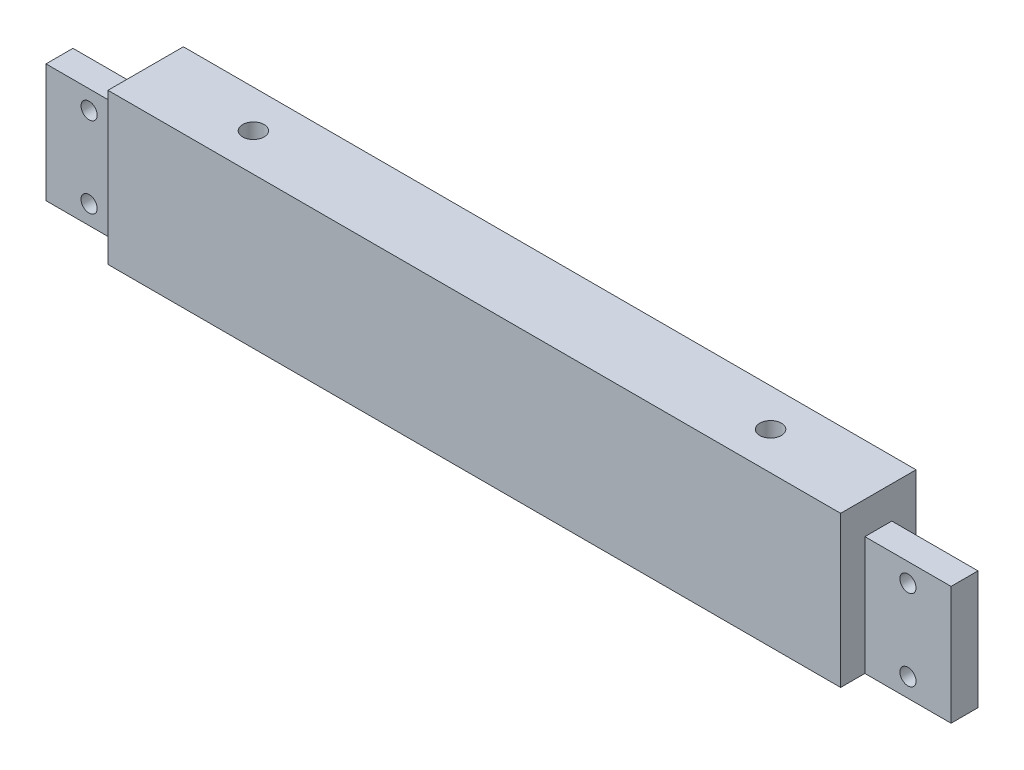
ISO-10303-21;
HEADER;
FILE_DESCRIPTION(('STEP AP214'),'2;1');
FILE_NAME('part.step','',(''),(''),'','','');
FILE_SCHEMA(('AUTOMOTIVE_DESIGN { 1 0 10303 214 1 1 1 1 }'));
ENDSEC;
DATA;
#1=APPLICATION_CONTEXT('core data for automotive mechanical design processes');
#2=APPLICATION_PROTOCOL_DEFINITION('international standard','automotive_design',2000,#1);
#3=PRODUCT_CONTEXT('',#1,'mechanical');
#4=PRODUCT('Part','Part','',(#3));
#5=PRODUCT_RELATED_PRODUCT_CATEGORY('part','',(#4));
#6=PRODUCT_DEFINITION_FORMATION('','',#4);
#7=PRODUCT_DEFINITION_CONTEXT('part definition',#1,'design');
#8=PRODUCT_DEFINITION('design','',#6,#7);
#9=PRODUCT_DEFINITION_SHAPE('','',#8);
#10=(LENGTH_UNIT() NAMED_UNIT(*) SI_UNIT(.MILLI.,.METRE.));
#11=(NAMED_UNIT(*) PLANE_ANGLE_UNIT() SI_UNIT($,.RADIAN.));
#12=(NAMED_UNIT(*) SI_UNIT($,.STERADIAN.) SOLID_ANGLE_UNIT());
#13=UNCERTAINTY_MEASURE_WITH_UNIT(LENGTH_MEASURE(1.E-05),#10,'distance_accuracy_value','');
#14=(GEOMETRIC_REPRESENTATION_CONTEXT(3) GLOBAL_UNCERTAINTY_ASSIGNED_CONTEXT((#13)) GLOBAL_UNIT_ASSIGNED_CONTEXT((#10,
#11,#12)) REPRESENTATION_CONTEXT('',''));
#15=CARTESIAN_POINT('',(0.,0.,0.));
#16=DIRECTION('',(0.,0.,1.));
#17=DIRECTION('',(1.,0.,0.));
#18=AXIS2_PLACEMENT_3D('',#15,#16,#17);
#19=CARTESIAN_POINT('',(-215.9,44.45,22.225));
#20=DIRECTION('',(1.,0.,0.));
#21=DIRECTION('',(0.,0.,-1.));
#22=AXIS2_PLACEMENT_3D('',#19,#20,#21);
#23=PLANE('',#22);
#24=DIRECTION('',(0.,0.,1.));
#25=VECTOR('',#24,1.);
#26=CARTESIAN_POINT('',(-215.9,25.4,-7.93749999999999));
#27=LINE('',#26,#25);
#28=CARTESIAN_POINT('',(-215.9,25.4,-7.93749999999999));
#29=VERTEX_POINT('',#28);
#30=CARTESIAN_POINT('',(-215.9,25.4,7.93750000000001));
#31=VERTEX_POINT('',#30);
#32=EDGE_CURVE('E49',#29,#31,#27,.T.);
#33=ORIENTED_EDGE('',*,*,#32,.T.);
#34=DIRECTION('',(0.,-1.,0.));
#35=VECTOR('',#34,1.);
#36=CARTESIAN_POINT('',(-215.9,25.4,7.93750000000001));
#37=LINE('',#36,#35);
#38=CARTESIAN_POINT('',(-215.9,-44.45,7.9375));
#39=VERTEX_POINT('',#38);
#40=EDGE_CURVE('E142',#31,#39,#37,.T.);
#41=ORIENTED_EDGE('',*,*,#40,.T.);
#42=DIRECTION('',(0.,0.,-1.));
#43=VECTOR('',#42,1.);
#44=CARTESIAN_POINT('',(-215.9,-44.45,22.225));
#45=LINE('',#44,#43);
#46=CARTESIAN_POINT('',(-215.9,-44.45,22.225));
#47=VERTEX_POINT('',#46);
#48=EDGE_CURVE('E11',#47,#39,#45,.T.);
#49=ORIENTED_EDGE('',*,*,#48,.F.);
#50=DIRECTION('',(0.,-1.,0.));
#51=VECTOR('',#50,1.);
#52=CARTESIAN_POINT('',(-215.9,44.45,22.225));
#53=LINE('',#52,#51);
#54=CARTESIAN_POINT('',(-215.9,44.45,22.225));
#55=VERTEX_POINT('',#54);
#56=EDGE_CURVE('E197',#55,#47,#53,.T.);
#57=ORIENTED_EDGE('',*,*,#56,.F.);
#58=DIRECTION('',(0.,0.,-1.));
#59=VECTOR('',#58,1.);
#60=CARTESIAN_POINT('',(-215.9,44.45,22.225));
#61=LINE('',#60,#59);
#62=CARTESIAN_POINT('',(-215.9,44.45,-22.225));
#63=VERTEX_POINT('',#62);
#64=EDGE_CURVE('E207',#55,#63,#61,.T.);
#65=ORIENTED_EDGE('',*,*,#64,.T.);
#66=DIRECTION('',(0.,-1.,0.));
#67=VECTOR('',#66,1.);
#68=CARTESIAN_POINT('',(-215.9,44.45,-22.225));
#69=LINE('',#68,#67);
#70=CARTESIAN_POINT('',(-215.9,-44.45,-22.225));
#71=VERTEX_POINT('',#70);
#72=EDGE_CURVE('E196',#63,#71,#69,.T.);
#73=ORIENTED_EDGE('',*,*,#72,.T.);
#74=CARTESIAN_POINT('',(-215.9,-44.45,-7.9375));
#75=VERTEX_POINT('',#74);
#76=EDGE_CURVE('E41',#75,#71,#45,.T.);
#77=ORIENTED_EDGE('',*,*,#76,.F.);
#78=DIRECTION('',(0.,-1.,0.));
#79=VECTOR('',#78,1.);
#80=CARTESIAN_POINT('',(-215.9,25.4,-7.93749999999999));
#81=LINE('',#80,#79);
#82=EDGE_CURVE('E54',#29,#75,#81,.T.);
#83=ORIENTED_EDGE('',*,*,#82,.F.);
#84=EDGE_LOOP('',(#33,#41,#49,#57,#65,#73,#77,#83));
#85=FACE_BOUND('',#84,.T.);
#86=ADVANCED_FACE('F33',(#85),#23,.F.);
#87=CARTESIAN_POINT('',(215.9,-44.45,22.225));
#88=DIRECTION('',(0.,1.,0.));
#89=DIRECTION('',(-1.,0.,0.));
#90=AXIS2_PLACEMENT_3D('',#87,#88,#89);
#91=PLANE('',#90);
#92=CARTESIAN_POINT('',(152.4,-44.45,0.));
#93=DIRECTION('',(0.,1.,0.));
#94=DIRECTION('',(-1.,0.,0.));
#95=AXIS2_PLACEMENT_3D('',#92,#93,#94);
#96=CIRCLE('',#95,6.35);
#97=CARTESIAN_POINT('',(146.05,-44.45,0.));
#98=VERTEX_POINT('',#97);
#99=EDGE_CURVE('E341',#98,#98,#96,.T.);
#100=ORIENTED_EDGE('',*,*,#99,.T.);
#101=EDGE_LOOP('',(#100));
#102=FACE_BOUND('',#101,.T.);
#103=CARTESIAN_POINT('',(-152.4,-44.4500000000001,0.));
#104=DIRECTION('',(0.,1.,0.));
#105=DIRECTION('',(-1.,0.,0.));
#106=AXIS2_PLACEMENT_3D('',#103,#104,#105);
#107=CIRCLE('',#106,6.35);
#108=CARTESIAN_POINT('',(-158.75,-44.4500000000001,0.));
#109=VERTEX_POINT('',#108);
#110=EDGE_CURVE('E349',#109,#109,#107,.T.);
#111=ORIENTED_EDGE('',*,*,#110,.T.);
#112=EDGE_LOOP('',(#111));
#113=FACE_BOUND('',#112,.T.);
#114=DIRECTION('',(1.,0.,0.));
#115=VECTOR('',#114,1.);
#116=CARTESIAN_POINT('',(215.9,-44.45,-22.225));
#117=LINE('',#116,#115);
#118=CARTESIAN_POINT('',(215.9,-44.45,-22.225));
#119=VERTEX_POINT('',#118);
#120=EDGE_CURVE('E210',#71,#119,#117,.T.);
#121=ORIENTED_EDGE('',*,*,#120,.T.);
#122=DIRECTION('',(0.,0.,-1.));
#123=VECTOR('',#122,1.);
#124=CARTESIAN_POINT('',(215.9,-44.45,22.225));
#125=LINE('',#124,#123);
#126=CARTESIAN_POINT('',(215.9,-44.45,-7.9375));
#127=VERTEX_POINT('',#126);
#128=EDGE_CURVE('E221',#127,#119,#125,.T.);
#129=ORIENTED_EDGE('',*,*,#128,.F.);
#130=DIRECTION('',(-1.,0.,0.));
#131=VECTOR('',#130,1.);
#132=CARTESIAN_POINT('',(266.7,-44.45,-7.9375));
#133=LINE('',#132,#131);
#134=CARTESIAN_POINT('',(266.7,-44.45,-7.9375));
#135=VERTEX_POINT('',#134);
#136=EDGE_CURVE('E187',#135,#127,#133,.T.);
#137=ORIENTED_EDGE('',*,*,#136,.F.);
#138=DIRECTION('',(0.,0.,1.));
#139=VECTOR('',#138,1.);
#140=CARTESIAN_POINT('',(266.7,-44.45,-7.9375));
#141=LINE('',#140,#139);
#142=CARTESIAN_POINT('',(266.7,-44.45,7.9375));
#143=VERTEX_POINT('',#142);
#144=EDGE_CURVE('E171',#135,#143,#141,.T.);
#145=ORIENTED_EDGE('',*,*,#144,.T.);
#146=DIRECTION('',(-1.,0.,0.));
#147=VECTOR('',#146,1.);
#148=CARTESIAN_POINT('',(266.7,-44.45,7.9375));
#149=LINE('',#148,#147);
#150=CARTESIAN_POINT('',(215.9,-44.45,7.9375));
#151=VERTEX_POINT('',#150);
#152=EDGE_CURVE('E190',#143,#151,#149,.T.);
#153=ORIENTED_EDGE('',*,*,#152,.T.);
#154=CARTESIAN_POINT('',(215.9,-44.45,22.225));
#155=VERTEX_POINT('',#154);
#156=EDGE_CURVE('E222',#155,#151,#125,.T.);
#157=ORIENTED_EDGE('',*,*,#156,.F.);
#158=DIRECTION('',(1.,0.,0.));
#159=VECTOR('',#158,1.);
#160=CARTESIAN_POINT('',(215.9,-44.45,22.225));
#161=LINE('',#160,#159);
#162=EDGE_CURVE('E200',#47,#155,#161,.T.);
#163=ORIENTED_EDGE('',*,*,#162,.F.);
#164=ORIENTED_EDGE('',*,*,#48,.T.);
#165=DIRECTION('',(1.,0.,0.));
#166=VECTOR('',#165,1.);
#167=CARTESIAN_POINT('',(-266.7,-44.45,7.9375));
#168=LINE('',#167,#166);
#169=CARTESIAN_POINT('',(-266.7,-44.45,7.9375));
#170=VERTEX_POINT('',#169);
#171=EDGE_CURVE('E155',#170,#39,#168,.T.);
#172=ORIENTED_EDGE('',*,*,#171,.F.);
#173=DIRECTION('',(0.,0.,1.));
#174=VECTOR('',#173,1.);
#175=CARTESIAN_POINT('',(-266.7,-44.45,-7.9375));
#176=LINE('',#175,#174);
#177=CARTESIAN_POINT('',(-266.7,-44.45,-7.9375));
#178=VERTEX_POINT('',#177);
#179=EDGE_CURVE('E137',#178,#170,#176,.T.);
#180=ORIENTED_EDGE('',*,*,#179,.F.);
#181=DIRECTION('',(1.,0.,0.));
#182=VECTOR('',#181,1.);
#183=CARTESIAN_POINT('',(-266.7,-44.45,-7.9375));
#184=LINE('',#183,#182);
#185=EDGE_CURVE('E129',#178,#75,#184,.T.);
#186=ORIENTED_EDGE('',*,*,#185,.T.);
#187=ORIENTED_EDGE('',*,*,#76,.T.);
#188=EDGE_LOOP('',(#121,#129,#137,#145,#153,#157,#163,#164,#172,#180,#186,#187));
#189=FACE_BOUND('',#188,.T.);
#190=ADVANCED_FACE('F242',(#102,#113,#189),#91,.F.);
#191=CARTESIAN_POINT('',(215.9,44.45,22.225));
#192=DIRECTION('',(-1.,0.,0.));
#193=DIRECTION('',(0.,0.,1.));
#194=AXIS2_PLACEMENT_3D('',#191,#192,#193);
#195=PLANE('',#194);
#196=DIRECTION('',(0.,0.,1.));
#197=VECTOR('',#196,1.);
#198=CARTESIAN_POINT('',(215.9,25.4,-7.93749999999999));
#199=LINE('',#198,#197);
#200=CARTESIAN_POINT('',(215.9,25.4,-7.93749999999999));
#201=VERTEX_POINT('',#200);
#202=CARTESIAN_POINT('',(215.9,25.4,7.93750000000001));
#203=VERTEX_POINT('',#202);
#204=EDGE_CURVE('E178',#201,#203,#199,.T.);
#205=ORIENTED_EDGE('',*,*,#204,.F.);
#206=DIRECTION('',(0.,-1.,0.));
#207=VECTOR('',#206,1.);
#208=CARTESIAN_POINT('',(215.9,25.4,-7.93749999999999));
#209=LINE('',#208,#207);
#210=EDGE_CURVE('E169',#201,#127,#209,.T.);
#211=ORIENTED_EDGE('',*,*,#210,.T.);
#212=ORIENTED_EDGE('',*,*,#128,.T.);
#213=DIRECTION('',(0.,1.,0.));
#214=VECTOR('',#213,1.);
#215=CARTESIAN_POINT('',(215.9,44.45,-22.225));
#216=LINE('',#215,#214);
#217=CARTESIAN_POINT('',(215.9,44.45,-22.225));
#218=VERTEX_POINT('',#217);
#219=EDGE_CURVE('E213',#119,#218,#216,.T.);
#220=ORIENTED_EDGE('',*,*,#219,.T.);
#221=DIRECTION('',(0.,0.,-1.));
#222=VECTOR('',#221,1.);
#223=CARTESIAN_POINT('',(215.9,44.45,22.225));
#224=LINE('',#223,#222);
#225=CARTESIAN_POINT('',(215.9,44.45,22.225));
#226=VERTEX_POINT('',#225);
#227=EDGE_CURVE('E218',#226,#218,#224,.T.);
#228=ORIENTED_EDGE('',*,*,#227,.F.);
#229=DIRECTION('',(0.,1.,0.));
#230=VECTOR('',#229,1.);
#231=CARTESIAN_POINT('',(215.9,44.45,22.225));
#232=LINE('',#231,#230);
#233=EDGE_CURVE('E203',#155,#226,#232,.T.);
#234=ORIENTED_EDGE('',*,*,#233,.F.);
#235=ORIENTED_EDGE('',*,*,#156,.T.);
#236=DIRECTION('',(0.,-1.,0.));
#237=VECTOR('',#236,1.);
#238=CARTESIAN_POINT('',(215.9,25.4,7.93750000000001));
#239=LINE('',#238,#237);
#240=EDGE_CURVE('E181',#203,#151,#239,.T.);
#241=ORIENTED_EDGE('',*,*,#240,.F.);
#242=EDGE_LOOP('',(#205,#211,#212,#220,#228,#234,#235,#241));
#243=FACE_BOUND('',#242,.T.);
#244=ADVANCED_FACE('F240',(#243),#195,.F.);
#245=CARTESIAN_POINT('',(215.9,44.45,22.225));
#246=DIRECTION('',(0.,-1.,0.));
#247=DIRECTION('',(1.,0.,0.));
#248=AXIS2_PLACEMENT_3D('',#245,#246,#247);
#249=PLANE('',#248);
#250=CARTESIAN_POINT('',(152.4,44.45,0.));
#251=DIRECTION('',(0.,1.,0.));
#252=DIRECTION('',(-1.,0.,0.));
#253=AXIS2_PLACEMENT_3D('',#250,#251,#252);
#254=CIRCLE('',#253,6.35);
#255=CARTESIAN_POINT('',(146.05,44.45,0.));
#256=VERTEX_POINT('',#255);
#257=EDGE_CURVE('E344',#256,#256,#254,.T.);
#258=ORIENTED_EDGE('',*,*,#257,.F.);
#259=EDGE_LOOP('',(#258));
#260=FACE_BOUND('',#259,.T.);
#261=CARTESIAN_POINT('',(-152.4,44.45,0.));
#262=DIRECTION('',(0.,1.,0.));
#263=DIRECTION('',(-1.,0.,0.));
#264=AXIS2_PLACEMENT_3D('',#261,#262,#263);
#265=CIRCLE('',#264,6.35);
#266=CARTESIAN_POINT('',(-158.75,44.45,0.));
#267=VERTEX_POINT('',#266);
#268=EDGE_CURVE('E346',#267,#267,#265,.T.);
#269=ORIENTED_EDGE('',*,*,#268,.F.);
#270=EDGE_LOOP('',(#269));
#271=FACE_BOUND('',#270,.T.);
#272=DIRECTION('',(-1.,0.,0.));
#273=VECTOR('',#272,1.);
#274=CARTESIAN_POINT('',(215.9,44.45,-22.225));
#275=LINE('',#274,#273);
#276=EDGE_CURVE('E201',#218,#63,#275,.T.);
#277=ORIENTED_EDGE('',*,*,#276,.T.);
#278=ORIENTED_EDGE('',*,*,#64,.F.);
#279=DIRECTION('',(-1.,0.,0.));
#280=VECTOR('',#279,1.);
#281=CARTESIAN_POINT('',(215.9,44.45,22.225));
#282=LINE('',#281,#280);
#283=EDGE_CURVE('E205',#226,#55,#282,.T.);
#284=ORIENTED_EDGE('',*,*,#283,.F.);
#285=ORIENTED_EDGE('',*,*,#227,.T.);
#286=EDGE_LOOP('',(#277,#278,#284,#285));
#287=FACE_BOUND('',#286,.T.);
#288=ADVANCED_FACE('F254',(#260,#271,#287),#249,.F.);
#289=CARTESIAN_POINT('',(0.,0.,22.225));
#290=DIRECTION('',(0.,0.,-1.));
#291=DIRECTION('',(-1.,0.,0.));
#292=AXIS2_PLACEMENT_3D('',#289,#290,#291);
#293=PLANE('',#292);
#294=ORIENTED_EDGE('',*,*,#56,.T.);
#295=ORIENTED_EDGE('',*,*,#162,.T.);
#296=ORIENTED_EDGE('',*,*,#233,.T.);
#297=ORIENTED_EDGE('',*,*,#283,.T.);
#298=EDGE_LOOP('',(#294,#295,#296,#297));
#299=FACE_BOUND('',#298,.T.);
#300=ADVANCED_FACE('F258',(#299),#293,.F.);
#301=CARTESIAN_POINT('',(0.,0.,-22.225));
#302=DIRECTION('',(0.,0.,-1.));
#303=DIRECTION('',(-1.,0.,0.));
#304=AXIS2_PLACEMENT_3D('',#301,#302,#303);
#305=PLANE('',#304);
#306=ORIENTED_EDGE('',*,*,#72,.F.);
#307=ORIENTED_EDGE('',*,*,#276,.F.);
#308=ORIENTED_EDGE('',*,*,#219,.F.);
#309=ORIENTED_EDGE('',*,*,#120,.F.);
#310=EDGE_LOOP('',(#306,#307,#308,#309));
#311=FACE_BOUND('',#310,.T.);
#312=ADVANCED_FACE('F249',(#311),#305,.T.);
#313=CARTESIAN_POINT('',(266.7,25.4,-7.93749999999999));
#314=DIRECTION('',(0.,-1.,0.));
#315=DIRECTION('',(0.,0.,-1.));
#316=AXIS2_PLACEMENT_3D('',#313,#314,#315);
#317=PLANE('',#316);
#318=ORIENTED_EDGE('',*,*,#204,.T.);
#319=DIRECTION('',(-1.,0.,0.));
#320=VECTOR('',#319,1.);
#321=CARTESIAN_POINT('',(266.7,25.4,7.93750000000001));
#322=LINE('',#321,#320);
#323=CARTESIAN_POINT('',(266.7,25.4,7.93750000000001));
#324=VERTEX_POINT('',#323);
#325=EDGE_CURVE('E193',#324,#203,#322,.T.);
#326=ORIENTED_EDGE('',*,*,#325,.F.);
#327=DIRECTION('',(0.,0.,1.));
#328=VECTOR('',#327,1.);
#329=CARTESIAN_POINT('',(266.7,25.4,-7.93749999999999));
#330=LINE('',#329,#328);
#331=CARTESIAN_POINT('',(266.7,25.4,-7.93749999999999));
#332=VERTEX_POINT('',#331);
#333=EDGE_CURVE('E165',#332,#324,#330,.T.);
#334=ORIENTED_EDGE('',*,*,#333,.F.);
#335=DIRECTION('',(-1.,0.,0.));
#336=VECTOR('',#335,1.);
#337=CARTESIAN_POINT('',(266.7,25.4,-7.93749999999999));
#338=LINE('',#337,#336);
#339=EDGE_CURVE('E177',#332,#201,#338,.T.);
#340=ORIENTED_EDGE('',*,*,#339,.T.);
#341=EDGE_LOOP('',(#318,#326,#334,#340));
#342=FACE_BOUND('',#341,.T.);
#343=ADVANCED_FACE('F265',(#342),#317,.F.);
#344=CARTESIAN_POINT('',(266.7,25.4,7.93750000000001));
#345=DIRECTION('',(0.,0.,-1.));
#346=DIRECTION('',(0.,1.,0.));
#347=AXIS2_PLACEMENT_3D('',#344,#345,#346);
#348=PLANE('',#347);
#349=CARTESIAN_POINT('',(241.3,-33.3375,7.93750000000001));
#350=DIRECTION('',(0.,0.,1.));
#351=DIRECTION('',(1.,0.,0.));
#352=AXIS2_PLACEMENT_3D('',#349,#350,#351);
#353=CIRCLE('',#352,4.76250000000001);
#354=CARTESIAN_POINT('',(246.0625,-33.3375,7.93750000000001));
#355=VERTEX_POINT('',#354);
#356=EDGE_CURVE('E128',#355,#355,#353,.T.);
#357=ORIENTED_EDGE('',*,*,#356,.F.);
#358=EDGE_LOOP('',(#357));
#359=FACE_BOUND('',#358,.T.);
#360=CARTESIAN_POINT('',(241.3,14.2875,7.93750000000001));
#361=DIRECTION('',(0.,0.,1.));
#362=DIRECTION('',(1.,0.,0.));
#363=AXIS2_PLACEMENT_3D('',#360,#361,#362);
#364=CIRCLE('',#363,4.76250000000001);
#365=CARTESIAN_POINT('',(246.0625,14.2875,7.93750000000001));
#366=VERTEX_POINT('',#365);
#367=EDGE_CURVE('E161',#366,#366,#364,.T.);
#368=ORIENTED_EDGE('',*,*,#367,.F.);
#369=EDGE_LOOP('',(#368));
#370=FACE_BOUND('',#369,.T.);
#371=ORIENTED_EDGE('',*,*,#240,.T.);
#372=ORIENTED_EDGE('',*,*,#152,.F.);
#373=DIRECTION('',(0.,-1.,0.));
#374=VECTOR('',#373,1.);
#375=CARTESIAN_POINT('',(266.7,25.4,7.93750000000001));
#376=LINE('',#375,#374);
#377=EDGE_CURVE('E168',#324,#143,#376,.T.);
#378=ORIENTED_EDGE('',*,*,#377,.F.);
#379=ORIENTED_EDGE('',*,*,#325,.T.);
#380=EDGE_LOOP('',(#371,#372,#378,#379));
#381=FACE_BOUND('',#380,.T.);
#382=ADVANCED_FACE('F233',(#359,#370,#381),#348,.F.);
#383=CARTESIAN_POINT('',(266.7,25.4,-7.93749999999999));
#384=DIRECTION('',(0.,0.,-1.));
#385=DIRECTION('',(0.,1.,0.));
#386=AXIS2_PLACEMENT_3D('',#383,#384,#385);
#387=PLANE('',#386);
#388=CARTESIAN_POINT('',(241.3,-33.3375,-7.9375));
#389=DIRECTION('',(0.,0.,-1.));
#390=DIRECTION('',(0.,1.,0.));
#391=AXIS2_PLACEMENT_3D('',#388,#389,#390);
#392=CIRCLE('',#391,4.76250000000001);
#393=CARTESIAN_POINT('',(241.3,-28.575,-7.9375));
#394=VERTEX_POINT('',#393);
#395=EDGE_CURVE('E36',#394,#394,#392,.T.);
#396=ORIENTED_EDGE('',*,*,#395,.F.);
#397=EDGE_LOOP('',(#396));
#398=FACE_BOUND('',#397,.T.);
#399=CARTESIAN_POINT('',(241.3,14.2875,-7.93749999999999));
#400=DIRECTION('',(0.,0.,-1.));
#401=DIRECTION('',(0.,1.,0.));
#402=AXIS2_PLACEMENT_3D('',#399,#400,#401);
#403=CIRCLE('',#402,4.76250000000001);
#404=CARTESIAN_POINT('',(241.3,19.05,-7.93749999999999));
#405=VERTEX_POINT('',#404);
#406=EDGE_CURVE('E164',#405,#405,#403,.T.);
#407=ORIENTED_EDGE('',*,*,#406,.F.);
#408=EDGE_LOOP('',(#407));
#409=FACE_BOUND('',#408,.T.);
#410=ORIENTED_EDGE('',*,*,#210,.F.);
#411=ORIENTED_EDGE('',*,*,#339,.F.);
#412=DIRECTION('',(0.,-1.,0.));
#413=VECTOR('',#412,1.);
#414=CARTESIAN_POINT('',(266.7,25.4,-7.93749999999999));
#415=LINE('',#414,#413);
#416=EDGE_CURVE('E174',#332,#135,#415,.T.);
#417=ORIENTED_EDGE('',*,*,#416,.T.);
#418=ORIENTED_EDGE('',*,*,#136,.T.);
#419=EDGE_LOOP('',(#410,#411,#417,#418));
#420=FACE_BOUND('',#419,.T.);
#421=ADVANCED_FACE('F229',(#398,#409,#420),#387,.T.);
#422=CARTESIAN_POINT('',(266.7,0.,0.));
#423=DIRECTION('',(1.,0.,0.));
#424=DIRECTION('',(0.,0.,-1.));
#425=AXIS2_PLACEMENT_3D('',#422,#423,#424);
#426=PLANE('',#425);
#427=ORIENTED_EDGE('',*,*,#333,.T.);
#428=ORIENTED_EDGE('',*,*,#377,.T.);
#429=ORIENTED_EDGE('',*,*,#144,.F.);
#430=ORIENTED_EDGE('',*,*,#416,.F.);
#431=EDGE_LOOP('',(#427,#428,#429,#430));
#432=FACE_BOUND('',#431,.T.);
#433=ADVANCED_FACE('F232',(#432),#426,.T.);
#434=CARTESIAN_POINT('',(241.3,14.2875,-22.225));
#435=DIRECTION('',(0.,0.,1.));
#436=DIRECTION('',(1.,0.,0.));
#437=AXIS2_PLACEMENT_3D('',#434,#435,#436);
#438=CYLINDRICAL_SURFACE('',#437,4.76250000000001);
#439=ORIENTED_EDGE('',*,*,#406,.T.);
#440=EDGE_LOOP('',(#439));
#441=FACE_BOUND('',#440,.T.);
#442=ORIENTED_EDGE('',*,*,#367,.T.);
#443=EDGE_LOOP('',(#442));
#444=FACE_BOUND('',#443,.T.);
#445=ADVANCED_FACE('F226',(#441,#444),#438,.F.);
#446=CARTESIAN_POINT('',(241.3,-33.3375,-22.225));
#447=DIRECTION('',(0.,0.,1.));
#448=DIRECTION('',(1.,0.,0.));
#449=AXIS2_PLACEMENT_3D('',#446,#447,#448);
#450=CYLINDRICAL_SURFACE('',#449,4.76250000000001);
#451=ORIENTED_EDGE('',*,*,#395,.T.);
#452=EDGE_LOOP('',(#451));
#453=FACE_BOUND('',#452,.T.);
#454=ORIENTED_EDGE('',*,*,#356,.T.);
#455=EDGE_LOOP('',(#454));
#456=FACE_BOUND('',#455,.T.);
#457=ADVANCED_FACE('F273',(#453,#456),#450,.F.);
#458=CARTESIAN_POINT('',(-266.7,25.4,-7.93749999999999));
#459=DIRECTION('',(0.,1.,0.));
#460=DIRECTION('',(0.,0.,1.));
#461=AXIS2_PLACEMENT_3D('',#458,#459,#460);
#462=PLANE('',#461);
#463=ORIENTED_EDGE('',*,*,#32,.F.);
#464=DIRECTION('',(1.,0.,0.));
#465=VECTOR('',#464,1.);
#466=CARTESIAN_POINT('',(-266.7,25.4,-7.93749999999999));
#467=LINE('',#466,#465);
#468=CARTESIAN_POINT('',(-266.7,25.4,-7.93749999999999));
#469=VERTEX_POINT('',#468);
#470=EDGE_CURVE('E121',#469,#29,#467,.T.);
#471=ORIENTED_EDGE('',*,*,#470,.F.);
#472=DIRECTION('',(0.,0.,1.));
#473=VECTOR('',#472,1.);
#474=CARTESIAN_POINT('',(-266.7,25.4,-7.93749999999999));
#475=LINE('',#474,#473);
#476=CARTESIAN_POINT('',(-266.7,25.4,7.93750000000001));
#477=VERTEX_POINT('',#476);
#478=EDGE_CURVE('E125',#469,#477,#475,.T.);
#479=ORIENTED_EDGE('',*,*,#478,.T.);
#480=DIRECTION('',(1.,0.,0.));
#481=VECTOR('',#480,1.);
#482=CARTESIAN_POINT('',(-266.7,25.4,7.93750000000001));
#483=LINE('',#482,#481);
#484=EDGE_CURVE('E151',#477,#31,#483,.T.);
#485=ORIENTED_EDGE('',*,*,#484,.T.);
#486=EDGE_LOOP('',(#463,#471,#479,#485));
#487=FACE_BOUND('',#486,.T.);
#488=ADVANCED_FACE('F123',(#487),#462,.T.);
#489=CARTESIAN_POINT('',(-266.7,25.4,-7.93749999999999));
#490=DIRECTION('',(0.,0.,1.));
#491=DIRECTION('',(0.,-1.,0.));
#492=AXIS2_PLACEMENT_3D('',#489,#490,#491);
#493=PLANE('',#492);
#494=CARTESIAN_POINT('',(-241.3,-33.3375,-7.9375));
#495=DIRECTION('',(0.,0.,1.));
#496=DIRECTION('',(0.,-1.,0.));
#497=AXIS2_PLACEMENT_3D('',#494,#495,#496);
#498=CIRCLE('',#497,4.76250000000001);
#499=CARTESIAN_POINT('',(-241.3,-38.1,-7.9375));
#500=VERTEX_POINT('',#499);
#501=EDGE_CURVE('E357',#500,#500,#498,.F.);
#502=ORIENTED_EDGE('',*,*,#501,.F.);
#503=EDGE_LOOP('',(#502));
#504=FACE_BOUND('',#503,.T.);
#505=CARTESIAN_POINT('',(-241.3,14.2875,-7.93749999999999));
#506=DIRECTION('',(0.,0.,1.));
#507=DIRECTION('',(0.,-1.,0.));
#508=AXIS2_PLACEMENT_3D('',#505,#506,#507);
#509=CIRCLE('',#508,4.76250000000001);
#510=CARTESIAN_POINT('',(-241.3,9.52500000000003,-7.93749999999999));
#511=VERTEX_POINT('',#510);
#512=EDGE_CURVE('E146',#511,#511,#509,.F.);
#513=ORIENTED_EDGE('',*,*,#512,.F.);
#514=EDGE_LOOP('',(#513));
#515=FACE_BOUND('',#514,.T.);
#516=ORIENTED_EDGE('',*,*,#82,.T.);
#517=ORIENTED_EDGE('',*,*,#185,.F.);
#518=DIRECTION('',(0.,-1.,0.));
#519=VECTOR('',#518,1.);
#520=CARTESIAN_POINT('',(-266.7,25.4,-7.93749999999999));
#521=LINE('',#520,#519);
#522=EDGE_CURVE('E132',#469,#178,#521,.T.);
#523=ORIENTED_EDGE('',*,*,#522,.F.);
#524=ORIENTED_EDGE('',*,*,#470,.T.);
#525=EDGE_LOOP('',(#516,#517,#523,#524));
#526=FACE_BOUND('',#525,.T.);
#527=ADVANCED_FACE('F133',(#504,#515,#526),#493,.F.);
#528=CARTESIAN_POINT('',(-266.7,25.4,7.93750000000001));
#529=DIRECTION('',(0.,0.,1.));
#530=DIRECTION('',(0.,-1.,0.));
#531=AXIS2_PLACEMENT_3D('',#528,#529,#530);
#532=PLANE('',#531);
#533=CARTESIAN_POINT('',(-241.3,-33.3375,7.93750000000001));
#534=DIRECTION('',(0.,0.,-1.));
#535=DIRECTION('',(-1.,0.,0.));
#536=AXIS2_PLACEMENT_3D('',#533,#534,#535);
#537=CIRCLE('',#536,4.76250000000001);
#538=CARTESIAN_POINT('',(-246.0625,-33.3375,7.93750000000001));
#539=VERTEX_POINT('',#538);
#540=EDGE_CURVE('E352',#539,#539,#537,.T.);
#541=ORIENTED_EDGE('',*,*,#540,.T.);
#542=EDGE_LOOP('',(#541));
#543=FACE_BOUND('',#542,.T.);
#544=CARTESIAN_POINT('',(-241.3,14.2875,7.93750000000001));
#545=DIRECTION('',(0.,0.,-1.));
#546=DIRECTION('',(-1.,0.,0.));
#547=AXIS2_PLACEMENT_3D('',#544,#545,#546);
#548=CIRCLE('',#547,4.76250000000001);
#549=CARTESIAN_POINT('',(-246.0625,14.2875,7.93750000000001));
#550=VERTEX_POINT('',#549);
#551=EDGE_CURVE('E359',#550,#550,#548,.T.);
#552=ORIENTED_EDGE('',*,*,#551,.T.);
#553=EDGE_LOOP('',(#552));
#554=FACE_BOUND('',#553,.T.);
#555=ORIENTED_EDGE('',*,*,#40,.F.);
#556=ORIENTED_EDGE('',*,*,#484,.F.);
#557=DIRECTION('',(0.,-1.,0.));
#558=VECTOR('',#557,1.);
#559=CARTESIAN_POINT('',(-266.7,25.4,7.93750000000001));
#560=LINE('',#559,#558);
#561=EDGE_CURVE('E141',#477,#170,#560,.T.);
#562=ORIENTED_EDGE('',*,*,#561,.T.);
#563=ORIENTED_EDGE('',*,*,#171,.T.);
#564=EDGE_LOOP('',(#555,#556,#562,#563));
#565=FACE_BOUND('',#564,.T.);
#566=ADVANCED_FACE('F315',(#543,#554,#565),#532,.T.);
#567=CARTESIAN_POINT('',(-266.7,0.,0.));
#568=DIRECTION('',(-1.,0.,0.));
#569=DIRECTION('',(0.,0.,-1.));
#570=AXIS2_PLACEMENT_3D('',#567,#568,#569);
#571=PLANE('',#570);
#572=ORIENTED_EDGE('',*,*,#478,.F.);
#573=ORIENTED_EDGE('',*,*,#522,.T.);
#574=ORIENTED_EDGE('',*,*,#179,.T.);
#575=ORIENTED_EDGE('',*,*,#561,.F.);
#576=EDGE_LOOP('',(#572,#573,#574,#575));
#577=FACE_BOUND('',#576,.T.);
#578=ADVANCED_FACE('F139',(#577),#571,.T.);
#579=CARTESIAN_POINT('',(-241.3,14.2875,-22.225));
#580=DIRECTION('',(0.,0.,1.));
#581=DIRECTION('',(1.,0.,0.));
#582=AXIS2_PLACEMENT_3D('',#579,#580,#581);
#583=CYLINDRICAL_SURFACE('',#582,4.76250000000001);
#584=ORIENTED_EDGE('',*,*,#551,.F.);
#585=EDGE_LOOP('',(#584));
#586=FACE_BOUND('',#585,.T.);
#587=ORIENTED_EDGE('',*,*,#512,.T.);
#588=EDGE_LOOP('',(#587));
#589=FACE_BOUND('',#588,.T.);
#590=ADVANCED_FACE('F322',(#586,#589),#583,.F.);
#591=CARTESIAN_POINT('',(-241.3,-33.3375,-22.225));
#592=DIRECTION('',(0.,0.,1.));
#593=DIRECTION('',(1.,0.,0.));
#594=AXIS2_PLACEMENT_3D('',#591,#592,#593);
#595=CYLINDRICAL_SURFACE('',#594,4.76250000000001);
#596=ORIENTED_EDGE('',*,*,#540,.F.);
#597=EDGE_LOOP('',(#596));
#598=FACE_BOUND('',#597,.T.);
#599=ORIENTED_EDGE('',*,*,#501,.T.);
#600=EDGE_LOOP('',(#599));
#601=FACE_BOUND('',#600,.T.);
#602=ADVANCED_FACE('F325',(#598,#601),#595,.F.);
#603=CARTESIAN_POINT('',(-152.4,-44.4500000000001,0.));
#604=DIRECTION('',(0.,1.,0.));
#605=DIRECTION('',(-1.,0.,0.));
#606=AXIS2_PLACEMENT_3D('',#603,#604,#605);
#607=CYLINDRICAL_SURFACE('',#606,6.35);
#608=CARTESIAN_POINT('',(-158.75,-44.4500000000001,0.));
#609=CARTESIAN_POINT('',(-158.75,-43.5239583333334,0.));
#610=CARTESIAN_POINT('',(-158.75,-42.5979166666667,0.));
#611=CARTESIAN_POINT('',(-158.75,-40.7458333333334,0.));
#612=CARTESIAN_POINT('',(-158.75,-39.8197916666667,0.));
#613=CARTESIAN_POINT('',(-158.75,-37.9677083333334,0.));
#614=CARTESIAN_POINT('',(-158.75,-37.0416666666667,0.));
#615=CARTESIAN_POINT('',(-158.75,-35.1895833333334,0.));
#616=CARTESIAN_POINT('',(-158.75,-34.2635416666667,0.));
#617=CARTESIAN_POINT('',(-158.75,-32.4114583333334,0.));
#618=CARTESIAN_POINT('',(-158.75,-31.4854166666667,0.));
#619=CARTESIAN_POINT('',(-158.75,-29.6333333333334,0.));
#620=CARTESIAN_POINT('',(-158.75,-28.7072916666667,0.));
#621=CARTESIAN_POINT('',(-158.75,-26.8552083333334,0.));
#622=CARTESIAN_POINT('',(-158.75,-25.9291666666667,0.));
#623=CARTESIAN_POINT('',(-158.75,-24.0770833333334,0.));
#624=CARTESIAN_POINT('',(-158.75,-23.1510416666667,0.));
#625=CARTESIAN_POINT('',(-158.75,-21.2989583333334,0.));
#626=CARTESIAN_POINT('',(-158.75,-20.3729166666667,0.));
#627=CARTESIAN_POINT('',(-158.75,-18.5208333333334,0.));
#628=CARTESIAN_POINT('',(-158.75,-17.5947916666667,0.));
#629=CARTESIAN_POINT('',(-158.75,-15.7427083333334,0.));
#630=CARTESIAN_POINT('',(-158.75,-14.8166666666667,0.));
#631=CARTESIAN_POINT('',(-158.75,-12.9645833333334,0.));
#632=CARTESIAN_POINT('',(-158.75,-12.0385416666667,0.));
#633=CARTESIAN_POINT('',(-158.75,-10.1864583333334,0.));
#634=CARTESIAN_POINT('',(-158.75,-9.26041666666673,0.));
#635=CARTESIAN_POINT('',(-158.75,-7.40833333333339,0.));
#636=CARTESIAN_POINT('',(-158.75,-6.48229166666673,0.));
#637=CARTESIAN_POINT('',(-158.75,-4.63020833333339,0.));
#638=CARTESIAN_POINT('',(-158.75,-3.70416666666672,0.));
#639=CARTESIAN_POINT('',(-158.75,-1.85208333333339,0.));
#640=CARTESIAN_POINT('',(-158.75,-0.926041666666722,0.));
#641=CARTESIAN_POINT('',(-158.75,0.926041666666611,0.));
#642=CARTESIAN_POINT('',(-158.75,1.85208333333328,0.));
#643=CARTESIAN_POINT('',(-158.75,3.70416666666661,0.));
#644=CARTESIAN_POINT('',(-158.75,4.63020833333328,0.));
#645=CARTESIAN_POINT('',(-158.75,6.48229166666662,0.));
#646=CARTESIAN_POINT('',(-158.75,7.40833333333328,0.));
#647=CARTESIAN_POINT('',(-158.75,9.26041666666662,0.));
#648=CARTESIAN_POINT('',(-158.75,10.1864583333333,0.));
#649=CARTESIAN_POINT('',(-158.75,12.0385416666666,0.));
#650=CARTESIAN_POINT('',(-158.75,12.9645833333333,0.));
#651=CARTESIAN_POINT('',(-158.75,14.8166666666666,0.));
#652=CARTESIAN_POINT('',(-158.75,15.7427083333333,0.));
#653=CARTESIAN_POINT('',(-158.75,17.5947916666666,0.));
#654=CARTESIAN_POINT('',(-158.75,18.5208333333333,0.));
#655=CARTESIAN_POINT('',(-158.75,20.3729166666666,0.));
#656=CARTESIAN_POINT('',(-158.75,21.2989583333333,0.));
#657=CARTESIAN_POINT('',(-158.75,23.1510416666666,0.));
#658=CARTESIAN_POINT('',(-158.75,24.0770833333333,0.));
#659=CARTESIAN_POINT('',(-158.75,25.9291666666666,0.));
#660=CARTESIAN_POINT('',(-158.75,26.8552083333333,0.));
#661=CARTESIAN_POINT('',(-158.75,28.7072916666666,0.));
#662=CARTESIAN_POINT('',(-158.75,29.6333333333333,0.));
#663=CARTESIAN_POINT('',(-158.75,31.4854166666666,0.));
#664=CARTESIAN_POINT('',(-158.75,32.4114583333333,0.));
#665=CARTESIAN_POINT('',(-158.75,34.2635416666666,0.));
#666=CARTESIAN_POINT('',(-158.75,35.1895833333333,0.));
#667=CARTESIAN_POINT('',(-158.75,37.0416666666666,0.));
#668=CARTESIAN_POINT('',(-158.75,37.9677083333333,0.));
#669=CARTESIAN_POINT('',(-158.75,39.8197916666666,0.));
#670=CARTESIAN_POINT('',(-158.75,40.7458333333333,0.));
#671=CARTESIAN_POINT('',(-158.75,42.5979166666666,0.));
#672=CARTESIAN_POINT('',(-158.75,43.5239583333333,0.));
#673=CARTESIAN_POINT('',(-158.75,44.45,0.));
#674=B_SPLINE_CURVE_WITH_KNOTS('',3,(#608,#609,#610,#611,#612,#613,#614,#615,#616,#617,#618,
#619,#620,#621,#622,#623,#624,#625,#626,#627,#628,#629,#630,#631,#632,#633,#634,#635,#636,#637,
#638,#639,#640,#641,#642,#643,#644,#645,#646,#647,#648,#649,#650,#651,#652,#653,#654,#655,#656,
#657,#658,#659,#660,#661,#662,#663,#664,#665,#666,#667,#668,#669,#670,#671,#672,#673),
.UNSPECIFIED.,.F.,.F.,(4,2,2,2,2,2,2,2,2,2,2,2,2,2,2,2,2,2,2,2,2,2,2,2,2,2,2,2,2,2,2,2,4),(0.,
2.77812500000001,5.55625000000001,8.334375,11.1125,13.890625,16.66875,19.446875,22.225,
25.003125,27.78125,30.559375,33.3375,36.115625,38.89375,41.671875,44.45,47.228125,50.00625,
52.784375,55.5625,58.340625,61.11875,63.896875,66.675,69.453125,72.23125,75.0093750000001,
77.7875000000001,80.5656250000001,83.3437500000001,86.1218750000001,88.9000000000001),.UNSPECIFIED.);
#675=EDGE_CURVE('BSEAM329',#109,#267,#674,.T.);
#676=ORIENTED_EDGE('',*,*,#110,.F.);
#677=ORIENTED_EDGE('',*,*,#268,.T.);
#678=ORIENTED_EDGE('',*,*,#675,.T.);
#679=ORIENTED_EDGE('',*,*,#675,.F.);
#680=EDGE_LOOP('',(#676,#678,#677,#679));
#681=FACE_BOUND('',#680,.T.);
#682=ADVANCED_FACE('F329',(#681),#607,.F.);
#683=CARTESIAN_POINT('',(152.4,-44.45,0.));
#684=DIRECTION('',(0.,1.,0.));
#685=DIRECTION('',(-1.,0.,0.));
#686=AXIS2_PLACEMENT_3D('',#683,#684,#685);
#687=CYLINDRICAL_SURFACE('',#686,6.35);
#688=CARTESIAN_POINT('',(146.05,-44.45,0.));
#689=CARTESIAN_POINT('',(146.05,-43.5239583333334,0.));
#690=CARTESIAN_POINT('',(146.05,-42.5979166666667,0.));
#691=CARTESIAN_POINT('',(146.05,-40.7458333333334,0.));
#692=CARTESIAN_POINT('',(146.05,-39.8197916666667,0.));
#693=CARTESIAN_POINT('',(146.05,-37.9677083333334,0.));
#694=CARTESIAN_POINT('',(146.05,-37.0416666666667,0.));
#695=CARTESIAN_POINT('',(146.05,-35.1895833333334,0.));
#696=CARTESIAN_POINT('',(146.05,-34.2635416666667,0.));
#697=CARTESIAN_POINT('',(146.05,-32.4114583333334,0.));
#698=CARTESIAN_POINT('',(146.05,-31.4854166666667,0.));
#699=CARTESIAN_POINT('',(146.05,-29.6333333333334,0.));
#700=CARTESIAN_POINT('',(146.05,-28.7072916666667,0.));
#701=CARTESIAN_POINT('',(146.05,-26.8552083333334,0.));
#702=CARTESIAN_POINT('',(146.05,-25.9291666666667,0.));
#703=CARTESIAN_POINT('',(146.05,-24.0770833333334,0.));
#704=CARTESIAN_POINT('',(146.05,-23.1510416666667,0.));
#705=CARTESIAN_POINT('',(146.05,-21.2989583333334,0.));
#706=CARTESIAN_POINT('',(146.05,-20.3729166666667,0.));
#707=CARTESIAN_POINT('',(146.05,-18.5208333333333,0.));
#708=CARTESIAN_POINT('',(146.05,-17.5947916666667,0.));
#709=CARTESIAN_POINT('',(146.05,-15.7427083333334,0.));
#710=CARTESIAN_POINT('',(146.05,-14.8166666666667,0.));
#711=CARTESIAN_POINT('',(146.05,-12.9645833333334,0.));
#712=CARTESIAN_POINT('',(146.05,-12.0385416666667,0.));
#713=CARTESIAN_POINT('',(146.05,-10.1864583333334,0.));
#714=CARTESIAN_POINT('',(146.05,-9.26041666666669,0.));
#715=CARTESIAN_POINT('',(146.05,-7.40833333333335,0.));
#716=CARTESIAN_POINT('',(146.05,-6.48229166666669,0.));
#717=CARTESIAN_POINT('',(146.05,-4.63020833333335,0.));
#718=CARTESIAN_POINT('',(146.05,-3.70416666666668,0.));
#719=CARTESIAN_POINT('',(146.05,-1.85208333333335,0.));
#720=CARTESIAN_POINT('',(146.05,-0.92604166666668,0.));
#721=CARTESIAN_POINT('',(146.05,0.926041666666652,0.));
#722=CARTESIAN_POINT('',(146.05,1.85208333333332,0.));
#723=CARTESIAN_POINT('',(146.05,3.70416666666665,0.));
#724=CARTESIAN_POINT('',(146.05,4.63020833333332,0.));
#725=CARTESIAN_POINT('',(146.05,6.48229166666666,0.));
#726=CARTESIAN_POINT('',(146.05,7.40833333333333,0.));
#727=CARTESIAN_POINT('',(146.05,9.26041666666666,0.));
#728=CARTESIAN_POINT('',(146.05,10.1864583333333,0.));
#729=CARTESIAN_POINT('',(146.05,12.0385416666667,0.));
#730=CARTESIAN_POINT('',(146.05,12.9645833333333,0.));
#731=CARTESIAN_POINT('',(146.05,14.8166666666667,0.));
#732=CARTESIAN_POINT('',(146.05,15.7427083333333,0.));
#733=CARTESIAN_POINT('',(146.05,17.5947916666667,0.));
#734=CARTESIAN_POINT('',(146.05,18.5208333333333,0.));
#735=CARTESIAN_POINT('',(146.05,20.3729166666667,0.));
#736=CARTESIAN_POINT('',(146.05,21.2989583333333,0.));
#737=CARTESIAN_POINT('',(146.05,23.1510416666667,0.));
#738=CARTESIAN_POINT('',(146.05,24.0770833333333,0.));
#739=CARTESIAN_POINT('',(146.05,25.9291666666667,0.));
#740=CARTESIAN_POINT('',(146.05,26.8552083333333,0.));
#741=CARTESIAN_POINT('',(146.05,28.7072916666667,0.));
#742=CARTESIAN_POINT('',(146.05,29.6333333333333,0.));
#743=CARTESIAN_POINT('',(146.05,31.4854166666667,0.));
#744=CARTESIAN_POINT('',(146.05,32.4114583333333,0.));
#745=CARTESIAN_POINT('',(146.05,34.2635416666667,0.));
#746=CARTESIAN_POINT('',(146.05,35.1895833333333,0.));
#747=CARTESIAN_POINT('',(146.05,37.0416666666667,0.));
#748=CARTESIAN_POINT('',(146.05,37.9677083333333,0.));
#749=CARTESIAN_POINT('',(146.05,39.8197916666667,0.));
#750=CARTESIAN_POINT('',(146.05,40.7458333333334,0.));
#751=CARTESIAN_POINT('',(146.05,42.5979166666667,0.));
#752=CARTESIAN_POINT('',(146.05,43.5239583333333,0.));
#753=CARTESIAN_POINT('',(146.05,44.45,0.));
#754=B_SPLINE_CURVE_WITH_KNOTS('',3,(#688,#689,#690,#691,#692,#693,#694,#695,#696,#697,#698,
#699,#700,#701,#702,#703,#704,#705,#706,#707,#708,#709,#710,#711,#712,#713,#714,#715,#716,#717,
#718,#719,#720,#721,#722,#723,#724,#725,#726,#727,#728,#729,#730,#731,#732,#733,#734,#735,#736,
#737,#738,#739,#740,#741,#742,#743,#744,#745,#746,#747,#748,#749,#750,#751,#752,#753),
.UNSPECIFIED.,.F.,.F.,(4,2,2,2,2,2,2,2,2,2,2,2,2,2,2,2,2,2,2,2,2,2,2,2,2,2,2,2,2,2,2,2,4),(0.,
2.77812500000001,5.55625000000001,8.334375,11.1125,13.890625,16.66875,19.446875,22.225,
25.003125,27.78125,30.559375,33.3375,36.115625,38.89375,41.671875,44.45,47.228125,50.00625,
52.784375,55.5625,58.340625,61.11875,63.896875,66.675,69.453125,72.23125,75.0093750000001,
77.7875000000001,80.5656250000001,83.3437500000001,86.1218750000001,88.9000000000001),.UNSPECIFIED.);
#755=EDGE_CURVE('BSEAM333',#98,#256,#754,.T.);
#756=ORIENTED_EDGE('',*,*,#99,.F.);
#757=ORIENTED_EDGE('',*,*,#257,.T.);
#758=ORIENTED_EDGE('',*,*,#755,.T.);
#759=ORIENTED_EDGE('',*,*,#755,.F.);
#760=EDGE_LOOP('',(#756,#758,#757,#759));
#761=FACE_BOUND('',#760,.T.);
#762=ADVANCED_FACE('F333',(#761),#687,.F.);
#763=CLOSED_SHELL('',(#86,#190,#244,#288,#300,#312,#343,#382,#421,#433,#445,#457,#488,#527,#566,
#578,#590,#602,#682,#762));
#764=MANIFOLD_SOLID_BREP('B2',#763);
#765=ADVANCED_BREP_SHAPE_REPRESENTATION('',(#18,#764),#14);
#766=SHAPE_DEFINITION_REPRESENTATION(#9,#765);
ENDSEC;
END-ISO-10303-21;
